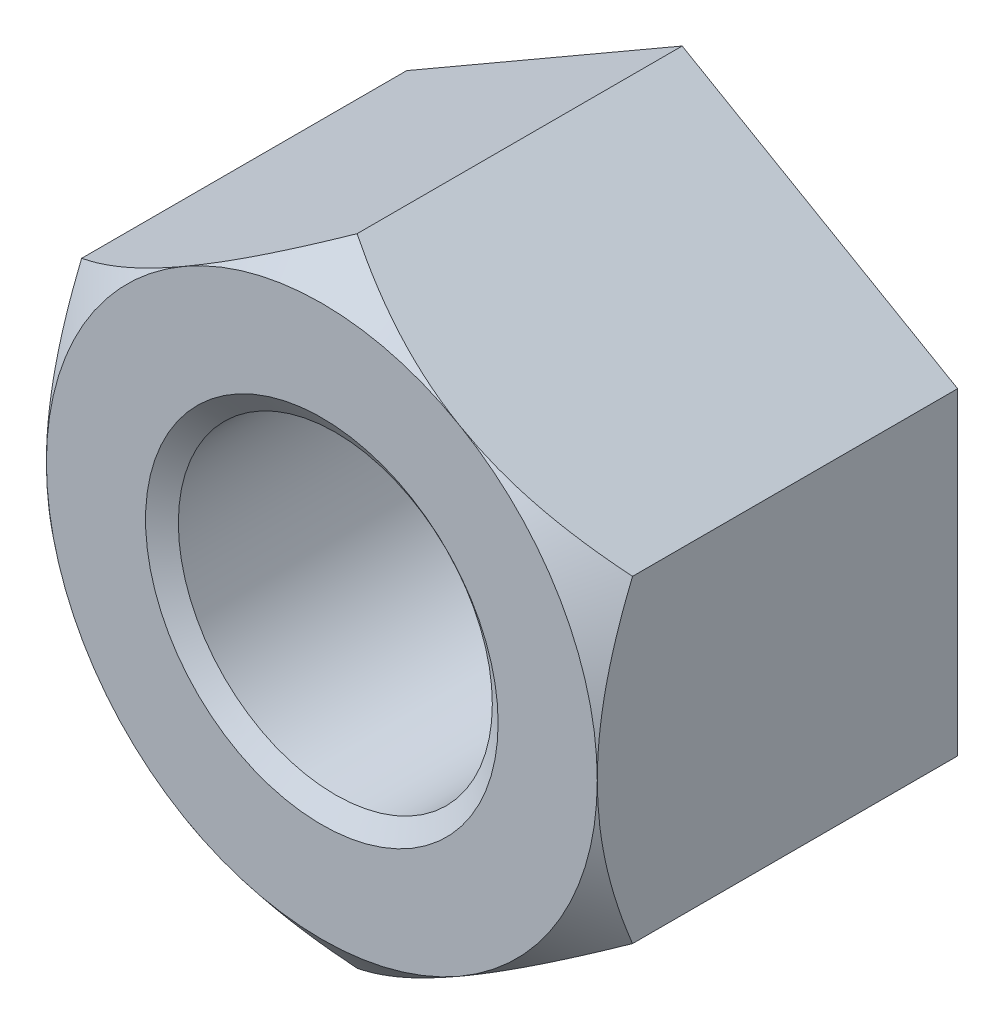
ISO-10303-21;
HEADER;
FILE_DESCRIPTION(('STEP AP214'),'2;1');
FILE_NAME('part.step','',(''),(''),'','','');
FILE_SCHEMA(('AUTOMOTIVE_DESIGN { 1 0 10303 214 1 1 1 1 }'));
ENDSEC;
DATA;
#1=APPLICATION_CONTEXT('core data for automotive mechanical design processes');
#2=APPLICATION_PROTOCOL_DEFINITION('international standard','automotive_design',2000,#1);
#3=PRODUCT_CONTEXT('',#1,'mechanical');
#4=PRODUCT('Part','Part','',(#3));
#5=PRODUCT_RELATED_PRODUCT_CATEGORY('part','',(#4));
#6=PRODUCT_DEFINITION_FORMATION('','',#4);
#7=PRODUCT_DEFINITION_CONTEXT('part definition',#1,'design');
#8=PRODUCT_DEFINITION('design','',#6,#7);
#9=PRODUCT_DEFINITION_SHAPE('','',#8);
#10=(LENGTH_UNIT() NAMED_UNIT(*) SI_UNIT(.MILLI.,.METRE.));
#11=(NAMED_UNIT(*) PLANE_ANGLE_UNIT() SI_UNIT($,.RADIAN.));
#12=(NAMED_UNIT(*) SI_UNIT($,.STERADIAN.) SOLID_ANGLE_UNIT());
#13=UNCERTAINTY_MEASURE_WITH_UNIT(LENGTH_MEASURE(1.E-05),#10,'distance_accuracy_value','');
#14=(GEOMETRIC_REPRESENTATION_CONTEXT(3) GLOBAL_UNCERTAINTY_ASSIGNED_CONTEXT((#13)) GLOBAL_UNIT_ASSIGNED_CONTEXT((#10,
#11,#12)) REPRESENTATION_CONTEXT('',''));
#15=CARTESIAN_POINT('',(0.,0.,0.));
#16=DIRECTION('',(0.,0.,1.));
#17=DIRECTION('',(1.,0.,0.));
#18=AXIS2_PLACEMENT_3D('',#15,#16,#17);
#19=CARTESIAN_POINT('',(0.,0.,-51.9176));
#20=DIRECTION('',(0.,0.,1.));
#21=DIRECTION('',(1.,0.,0.));
#22=AXIS2_PLACEMENT_3D('',#19,#20,#21);
#23=CYLINDRICAL_SURFACE('',#22,22.62124);
#24=CARTESIAN_POINT('',(0.,0.,-1.9457086988756));
#25=DIRECTION('',(0.,0.,1.));
#26=DIRECTION('',(1.,0.,0.));
#27=AXIS2_PLACEMENT_3D('',#24,#25,#26);
#28=CIRCLE('',#27,22.62124);
#29=CARTESIAN_POINT('',(22.62124,0.,-1.9457086988756));
#30=VERTEX_POINT('',#29);
#31=EDGE_CURVE('E130',#30,#30,#28,.F.);
#32=ORIENTED_EDGE('',*,*,#31,.F.);
#33=EDGE_LOOP('',(#32));
#34=FACE_BOUND('',#33,.T.);
#35=CARTESIAN_POINT('',(0.,0.,-49.9464913011244));
#36=DIRECTION('',(0.,0.,-1.));
#37=DIRECTION('',(-1.,0.,0.));
#38=AXIS2_PLACEMENT_3D('',#35,#36,#37);
#39=CIRCLE('',#38,22.62124);
#40=CARTESIAN_POINT('',(-22.62124,0.,-49.9464913011244));
#41=VERTEX_POINT('',#40);
#42=EDGE_CURVE('E37',#41,#41,#39,.F.);
#43=ORIENTED_EDGE('',*,*,#42,.F.);
#44=EDGE_LOOP('',(#43));
#45=FACE_BOUND('',#44,.T.);
#46=ADVANCED_FACE('F32',(#34,#45),#23,.F.);
#47=CARTESIAN_POINT('',(-79.3749999999999,0.,0.));
#48=DIRECTION('',(0.,0.,1.));
#49=DIRECTION('',(1.,0.,0.));
#50=AXIS2_PLACEMENT_3D('',#47,#48,#49);
#51=PLANE('',#50);
#52=CARTESIAN_POINT('',(0.,0.,0.));
#53=DIRECTION('',(0.,0.,1.));
#54=DIRECTION('',(1.,0.,0.));
#55=AXIS2_PLACEMENT_3D('',#52,#53,#54);
#56=CIRCLE('',#55,25.4);
#57=CARTESIAN_POINT('',(25.4,0.,0.));
#58=VERTEX_POINT('',#57);
#59=EDGE_CURVE('E217',#58,#58,#56,.T.);
#60=ORIENTED_EDGE('',*,*,#59,.F.);
#61=EDGE_LOOP('',(#60));
#62=FACE_BOUND('',#61,.T.);
#63=CARTESIAN_POINT('',(0.,0.,0.));
#64=DIRECTION('',(0.,0.,1.));
#65=DIRECTION('',(1.,0.,0.));
#66=AXIS2_PLACEMENT_3D('',#63,#64,#65);
#67=CIRCLE('',#66,39.6875);
#68=CARTESIAN_POINT('',(39.6875,0.,0.));
#69=VERTEX_POINT('',#68);
#70=CARTESIAN_POINT('',(19.84375,-34.3703832126949,0.));
#71=VERTEX_POINT('',#70);
#72=EDGE_CURVE('E11',#69,#71,#67,.F.);
#73=ORIENTED_EDGE('',*,*,#72,.F.);
#74=CARTESIAN_POINT('',(0.,0.,0.));
#75=DIRECTION('',(0.,0.,1.));
#76=DIRECTION('',(1.,0.,0.));
#77=AXIS2_PLACEMENT_3D('',#74,#75,#76);
#78=CIRCLE('',#77,39.6875);
#79=CARTESIAN_POINT('',(19.8437500000001,34.3703832126949,0.));
#80=VERTEX_POINT('',#79);
#81=EDGE_CURVE('E122',#69,#80,#78,.T.);
#82=ORIENTED_EDGE('',*,*,#81,.T.);
#83=CARTESIAN_POINT('',(-19.84375,34.3703832126949,0.));
#84=VERTEX_POINT('',#83);
#85=EDGE_CURVE('E44',#84,#80,#67,.F.);
#86=ORIENTED_EDGE('',*,*,#85,.F.);
#87=CARTESIAN_POINT('',(-39.6875,0.,0.));
#88=VERTEX_POINT('',#87);
#89=EDGE_CURVE('E271',#88,#84,#67,.F.);
#90=ORIENTED_EDGE('',*,*,#89,.F.);
#91=CARTESIAN_POINT('',(-19.84375,-34.3703832126949,0.));
#92=VERTEX_POINT('',#91);
#93=EDGE_CURVE('E273',#92,#88,#67,.F.);
#94=ORIENTED_EDGE('',*,*,#93,.F.);
#95=EDGE_CURVE('E42',#71,#92,#67,.F.);
#96=ORIENTED_EDGE('',*,*,#95,.F.);
#97=EDGE_LOOP('',(#73,#82,#86,#90,#94,#96));
#98=FACE_BOUND('',#97,.T.);
#99=ADVANCED_FACE('F132',(#62,#98),#51,.T.);
#100=CARTESIAN_POINT('',(0.,45.8271776169266,-51.9176));
#101=DIRECTION('',(-0.500000000000001,0.866025403784438,0.));
#102=DIRECTION('',(-0.866025403784438,-0.500000000000001,0.));
#103=AXIS2_PLACEMENT_3D('',#100,#101,#102);
#104=PLANE('',#103);
#105=CARTESIAN_POINT('',(0.000200000000008648,45.8272930869804,-5.08009554086177));
#106=CARTESIAN_POINT('',(-0.675362378218132,45.4372569660618,-4.75740980637057));
#107=CARTESIAN_POINT('',(-1.3547569213277,45.0450083437115,-4.44518483659009));
#108=CARTESIAN_POINT('',(-2.72161040098432,44.255855119289,-3.8444644403435));
#109=CARTESIAN_POINT('',(-3.40907190062726,43.8589490374126,-3.55597680269755));
#110=CARTESIAN_POINT('',(-4.79420473338667,43.0592422235556,-3.00488379402706));
#111=CARTESIAN_POINT('',(-5.49190147905994,42.6564268196284,-2.74236315877935));
#112=CARTESIAN_POINT('',(-6.89523688741963,41.8462107438486,-2.24748448913265));
#113=CARTESIAN_POINT('',(-7.60087484104338,41.4388104813735,-2.0151237846422));
#114=CARTESIAN_POINT('',(-9.01334120141884,40.6233226479894,-1.58581833885084));
#115=CARTESIAN_POINT('',(-9.72010005572324,40.2152752332046,-1.38856992044724));
#116=CARTESIAN_POINT('',(-11.1404844329942,39.3952159306345,-1.03010323704616));
#117=CARTESIAN_POINT('',(-11.8541100481971,38.9832039895965,-0.868885456729332));
#118=CARTESIAN_POINT('',(-13.2863448470649,38.1563028429274,-0.585602272074939));
#119=CARTESIAN_POINT('',(-14.0049472620728,37.7414175451823,-0.463491507583696));
#120=CARTESIAN_POINT('',(-15.446538218661,36.9091146183348,-0.260639689408306));
#121=CARTESIAN_POINT('',(-16.1695267221796,36.4916970112073,-0.179898277247445));
#122=CARTESIAN_POINT('',(-17.630331069793,35.6483012278793,-0.0605545378182199));
#123=CARTESIAN_POINT('',(-18.368192043889,35.2222969958605,-0.0226825232988908));
#124=CARTESIAN_POINT('',(-19.8446204307072,34.3698806692918,0.00757152347880483));
#125=CARTESIAN_POINT('',(-20.5831878468339,33.9434685727764,-4.66645945184485E-05));
#126=CARTESIAN_POINT('',(-22.059242806536,33.0912678444537,-0.0606042335508548));
#127=CARTESIAN_POINT('',(-22.7967297343713,32.6654795681441,-0.113563491625037));
#128=CARTESIAN_POINT('',(-24.2683079349113,31.8158634979287,-0.263592304194731));
#129=CARTESIAN_POINT('',(-25.0023992066788,31.3920357045641,-0.360661870865582));
#130=CARTESIAN_POINT('',(-26.465573084514,30.5472718723246,-0.596784274101464));
#131=CARTESIAN_POINT('',(-27.194654967739,30.1263362507834,-0.735843044678707));
#132=CARTESIAN_POINT('',(-28.6463836691976,29.288180294206,-1.05312836783003));
#133=CARTESIAN_POINT('',(-29.3690302955407,28.8709600699578,-1.23135608432558));
#134=CARTESIAN_POINT('',(-30.8067522929465,28.0408908877358,-1.62370548470428));
#135=CARTESIAN_POINT('',(-31.5218294409757,27.6280409038298,-1.83781853634994));
#136=CARTESIAN_POINT('',(-32.944072074641,26.8069087364301,-2.2985964240863));
#137=CARTESIAN_POINT('',(-33.6512373169414,26.3986266934264,-2.54526225838923));
#138=CARTESIAN_POINT('',(-34.8062681966621,25.7317693040973,-2.97446619349774));
#139=CARTESIAN_POINT('',(-35.2565422540784,25.471803455839,-3.14844506359477));
#140=CARTESIAN_POINT('',(-36.1535852489752,24.9538954412606,-3.50755980192611));
#141=CARTESIAN_POINT('',(-36.6003552410455,24.695952666073,-3.69269215538246));
#142=CARTESIAN_POINT('',(-37.4890449541568,24.1828674209821,-4.07269340288885));
#143=CARTESIAN_POINT('',(-37.9309759964886,23.9277184147286,-4.26752708270077));
#144=CARTESIAN_POINT('',(-38.811702131736,23.4192309434612,-4.66680287394708));
#145=CARTESIAN_POINT('',(-39.2504964008522,23.1658929540681,-4.87124740983446));
#146=CARTESIAN_POINT('',(-39.6877,22.9134733384094,-5.08009554086174));
#147=B_SPLINE_CURVE_WITH_KNOTS('',3,(#105,#106,#107,#108,#109,#110,#111,#112,#113,#114,#115,
#116,#117,#118,#119,#120,#121,#122,#123,#124,#125,#126,#127,#128,#129,#130,#131,#132,#133,#134,
#135,#136,#137,#138,#139,#140,#141,#142,#143,#144,#145,#146),.UNSPECIFIED.,.F.,.F.,(4,2,2,2,2,2,
2,2,2,2,2,2,2,2,2,2,2,2,2,2,4),(0.,2.53259620096936,5.06602012425204,7.60745580196207,
10.1486663299222,12.6667002043744,15.1847679491354,17.6999043239812,20.2150189041161,
22.7723642868658,25.329722056122,27.888201526601,30.4466817032726,33.0055236196886,
35.5644415834371,38.1227448791952,40.6811266420771,42.3258117324123,43.9699812198112,
45.608565036544,47.2475644472487),.UNSPECIFIED.);
#148=CARTESIAN_POINT('',(0.,45.8271776169266,-5.08));
#149=VERTEX_POINT('',#148);
#150=EDGE_CURVE('E182',#149,#84,#147,.T.);
#151=ORIENTED_EDGE('',*,*,#150,.F.);
#152=DIRECTION('',(0.,0.,1.));
#153=VECTOR('',#152,1.);
#154=CARTESIAN_POINT('',(0.,45.8271776169266,-51.9176));
#155=LINE('',#154,#153);
#156=CARTESIAN_POINT('',(0.,45.8271776169266,-51.9176));
#157=VERTEX_POINT('',#156);
#158=EDGE_CURVE('E241',#157,#149,#155,.T.);
#159=ORIENTED_EDGE('',*,*,#158,.F.);
#160=DIRECTION('',(-0.866025403784438,-0.500000000000001,0.));
#161=VECTOR('',#160,1.);
#162=CARTESIAN_POINT('',(0.,45.8271776169266,-51.9176));
#163=LINE('',#162,#161);
#164=CARTESIAN_POINT('',(-39.6875,22.9135888084633,-51.9176));
#165=VERTEX_POINT('',#164);
#166=EDGE_CURVE('E138',#157,#165,#163,.T.);
#167=ORIENTED_EDGE('',*,*,#166,.T.);
#168=DIRECTION('',(0.,0.,1.));
#169=VECTOR('',#168,1.);
#170=CARTESIAN_POINT('',(-39.6875,22.9135888084633,-51.9176));
#171=LINE('',#170,#169);
#172=CARTESIAN_POINT('',(-39.6875,22.9135888084633,-5.08));
#173=VERTEX_POINT('',#172);
#174=EDGE_CURVE('E228',#165,#173,#171,.T.);
#175=ORIENTED_EDGE('',*,*,#174,.T.);
#176=EDGE_CURVE('E177',#84,#173,#147,.T.);
#177=ORIENTED_EDGE('',*,*,#176,.F.);
#178=EDGE_LOOP('',(#151,#159,#167,#175,#177));
#179=FACE_BOUND('',#178,.T.);
#180=ADVANCED_FACE('F34',(#179),#104,.T.);
#181=CARTESIAN_POINT('',(39.6875,22.9135888084632,-51.9176));
#182=DIRECTION('',(0.500000000000001,0.866025403784438,0.));
#183=DIRECTION('',(-0.866025403784438,0.500000000000001,0.));
#184=AXIS2_PLACEMENT_3D('',#181,#182,#183);
#185=PLANE('',#184);
#186=CARTESIAN_POINT('',(39.6877,22.9134733384094,-5.08009554086173));
#187=CARTESIAN_POINT('',(39.0121376217819,23.303509459328,-4.75740980637053));
#188=CARTESIAN_POINT('',(38.3327430786723,23.6957580816783,-4.44518483659006));
#189=CARTESIAN_POINT('',(36.9658895990157,24.4849113061008,-3.84446444034347));
#190=CARTESIAN_POINT('',(36.2784280993727,24.8818173879772,-3.55597680269752));
#191=CARTESIAN_POINT('',(34.8932952666133,25.6815242018342,-3.00488379402703));
#192=CARTESIAN_POINT('',(34.1955985209401,26.0843396057614,-2.74236315877932));
#193=CARTESIAN_POINT('',(32.7922631125804,26.8945556815412,-2.24748448913262));
#194=CARTESIAN_POINT('',(32.0866251589566,27.3019559440163,-2.01512378464218));
#195=CARTESIAN_POINT('',(30.6741587985812,28.1174437774003,-1.58581833885082));
#196=CARTESIAN_POINT('',(29.9673999442768,28.5254911921851,-1.38856992044722));
#197=CARTESIAN_POINT('',(28.5470155670058,29.3455504947553,-1.03010323704614));
#198=CARTESIAN_POINT('',(27.8333899518029,29.7575624357933,-0.868885456729311));
#199=CARTESIAN_POINT('',(26.4011551529351,30.5844635824624,-0.585602272074925));
#200=CARTESIAN_POINT('',(25.6825527379272,30.9993488802075,-0.463491507583685));
#201=CARTESIAN_POINT('',(24.240961781339,31.831651807055,-0.260639689408294));
#202=CARTESIAN_POINT('',(23.5179732778204,32.2490694141825,-0.179898277247429));
#203=CARTESIAN_POINT('',(22.057168930207,33.0924651975105,-0.060554537818203));
#204=CARTESIAN_POINT('',(21.3193079561111,33.5184694295293,-0.0226825232988767));
#205=CARTESIAN_POINT('',(19.8428795692928,34.370885756098,0.0075715234788147));
#206=CARTESIAN_POINT('',(19.1043121531661,34.7972978526134,-4.66645945098664E-05));
#207=CARTESIAN_POINT('',(17.628257193464,35.6494985809361,-0.0606042335508479));
#208=CARTESIAN_POINT('',(16.8907702656287,36.0752868572457,-0.11356349162503));
#209=CARTESIAN_POINT('',(15.4191920650887,36.924902927461,-0.263592304194725));
#210=CARTESIAN_POINT('',(14.6851007933213,37.3487307208257,-0.360661870865576));
#211=CARTESIAN_POINT('',(13.221926915486,38.1934945530651,-0.596784274101456));
#212=CARTESIAN_POINT('',(12.492845032261,38.6144301746064,-0.7358430446787));
#213=CARTESIAN_POINT('',(11.0411163308025,39.4525861311838,-1.05312836783002));
#214=CARTESIAN_POINT('',(10.3184697044593,39.869806355432,-1.23135608432557));
#215=CARTESIAN_POINT('',(8.88074770705356,40.699875537654,-1.62370548470428));
#216=CARTESIAN_POINT('',(8.16567055902438,41.11272552156,-1.83781853634994));
#217=CARTESIAN_POINT('',(6.74342792535908,41.9338576889596,-2.29859642408631));
#218=CARTESIAN_POINT('',(6.0362626830586,42.3421397319634,-2.54526225838923));
#219=CARTESIAN_POINT('',(4.8812318033379,43.0089971212925,-2.97446619349775));
#220=CARTESIAN_POINT('',(4.43095774592168,43.2689629695508,-3.14844506359478));
#221=CARTESIAN_POINT('',(3.53391475102487,43.7868709841292,-3.50755980192612));
#222=CARTESIAN_POINT('',(3.08714475895457,44.0448137593168,-3.69269215538248));
#223=CARTESIAN_POINT('',(2.19845504584327,44.5578990044077,-4.07269340288887));
#224=CARTESIAN_POINT('',(1.75652400351137,44.8130480106612,-4.26752708270078));
#225=CARTESIAN_POINT('',(0.875797868263966,45.3215354819287,-4.6668028739471));
#226=CARTESIAN_POINT('',(0.437003599147834,45.5748734713217,-4.87124740983448));
#227=CARTESIAN_POINT('',(-0.000199999999990547,45.8272930869804,-5.08009554086177));
#228=B_SPLINE_CURVE_WITH_KNOTS('',3,(#186,#187,#188,#189,#190,#191,#192,#193,#194,#195,#196,
#197,#198,#199,#200,#201,#202,#203,#204,#205,#206,#207,#208,#209,#210,#211,#212,#213,#214,#215,
#216,#217,#218,#219,#220,#221,#222,#223,#224,#225,#226,#227),.UNSPECIFIED.,.F.,.F.,(4,2,2,2,2,2,
2,2,2,2,2,2,2,2,2,2,2,2,2,2,4),(0.,2.53259620096935,5.06602012425204,7.60745580196207,
10.1486663299222,12.6667002043744,15.1847679491354,17.6999043239812,20.2150189041161,
22.7723642868658,25.329722056122,27.888201526601,30.4466817032726,33.0055236196886,
35.564441583437,38.1227448791951,40.681126642077,42.3258117324123,43.9699812198112,
45.608565036544,47.2475644472487),.UNSPECIFIED.);
#229=CARTESIAN_POINT('',(39.6875,22.9135888084633,-5.08));
#230=VERTEX_POINT('',#229);
#231=EDGE_CURVE('E125',#230,#80,#228,.T.);
#232=ORIENTED_EDGE('',*,*,#231,.F.);
#233=DIRECTION('',(0.,0.,1.));
#234=VECTOR('',#233,1.);
#235=CARTESIAN_POINT('',(39.6875,22.9135888084632,-51.9176));
#236=LINE('',#235,#234);
#237=CARTESIAN_POINT('',(39.6875,22.9135888084632,-51.9176));
#238=VERTEX_POINT('',#237);
#239=EDGE_CURVE('E137',#238,#230,#236,.T.);
#240=ORIENTED_EDGE('',*,*,#239,.F.);
#241=DIRECTION('',(-0.866025403784438,0.500000000000001,0.));
#242=VECTOR('',#241,1.);
#243=CARTESIAN_POINT('',(39.6875,22.9135888084632,-51.9176));
#244=LINE('',#243,#242);
#245=EDGE_CURVE('E232',#238,#157,#244,.T.);
#246=ORIENTED_EDGE('',*,*,#245,.T.);
#247=ORIENTED_EDGE('',*,*,#158,.T.);
#248=EDGE_CURVE('E148',#80,#149,#228,.T.);
#249=ORIENTED_EDGE('',*,*,#248,.F.);
#250=EDGE_LOOP('',(#232,#240,#246,#247,#249));
#251=FACE_BOUND('',#250,.T.);
#252=ADVANCED_FACE('F163',(#251),#185,.T.);
#253=CARTESIAN_POINT('',(39.6875,22.9135888084632,-51.9176));
#254=DIRECTION('',(-1.,0.,0.));
#255=DIRECTION('',(0.,-1.,0.));
#256=AXIS2_PLACEMENT_3D('',#253,#254,#255);
#257=PLANE('',#256);
#258=ORIENTED_EDGE('',*,*,#239,.T.);
#259=CARTESIAN_POINT('',(39.6875,-51.6328225617732,-21.0457198261144));
#260=CARTESIAN_POINT('',(39.6875,-50.9711763672413,-20.6116874485865));
#261=CARTESIAN_POINT('',(39.6875,-50.3081162489392,-20.1798041243193));
#262=CARTESIAN_POINT('',(39.6875,-48.9789178290214,-19.3207795147177));
#263=CARTESIAN_POINT('',(39.6875,-48.3127794809869,-18.8936383012255));
#264=CARTESIAN_POINT('',(39.6875,-46.9770520322295,-18.0444645788605));
#265=CARTESIAN_POINT('',(39.6875,-46.3074622267201,-17.6224331775177));
#266=CARTESIAN_POINT('',(39.6875,-44.9647085157808,-16.7841033357561));
#267=CARTESIAN_POINT('',(39.6875,-44.2915446227527,-16.3678048754624));
#268=CARTESIAN_POINT('',(39.6875,-42.2568910350694,-15.1226295216118));
#269=CARTESIAN_POINT('',(39.6875,-40.8894876977901,-14.303373472346));
#270=CARTESIAN_POINT('',(39.6875,-38.1364157157677,-12.6961963985621));
#271=CARTESIAN_POINT('',(39.6875,-36.7507482016962,-11.9082734463391));
#272=CARTESIAN_POINT('',(39.6875,-34.6202465175937,-10.7357414695621));
#273=CARTESIAN_POINT('',(39.6875,-33.883142153706,-10.3370700215875));
#274=CARTESIAN_POINT('',(39.6875,-32.4025093553702,-9.5518101034775));
#275=CARTESIAN_POINT('',(39.6875,-31.6589809026361,-9.1652216677508));
#276=CARTESIAN_POINT('',(39.6875,-30.1648802706844,-8.40558030869589));
#277=CARTESIAN_POINT('',(39.6875,-29.4143069750479,-8.03252957792258));
#278=CARTESIAN_POINT('',(39.6875,-27.9057210128597,-7.30176643813181));
#279=CARTESIAN_POINT('',(39.6875,-27.1477083873151,-6.94405394462548));
#280=CARTESIAN_POINT('',(39.6875,-25.6257322693701,-6.24685408494801));
#281=CARTESIAN_POINT('',(39.6875,-24.8617895693373,-5.9073214280591));
#282=CARTESIAN_POINT('',(39.6875,-23.3255198091508,-5.24768587063815));
#283=CARTESIAN_POINT('',(39.6875,-22.5531925628723,-4.92758340247225));
#284=CARTESIAN_POINT('',(39.6875,-21.0000557177916,-4.30940863178999));
#285=CARTESIAN_POINT('',(39.6875,-20.2192491500448,-4.01132873620555));
#286=CARTESIAN_POINT('',(39.6875,-18.6486688993825,-3.43983380916539));
#287=CARTESIAN_POINT('',(39.6875,-17.8588956110767,-3.16641769700037));
#288=CARTESIAN_POINT('',(39.6875,-16.2782209721058,-2.64980510868287));
#289=CARTESIAN_POINT('',(39.6875,-15.4874096982703,-2.40633404284441));
#290=CARTESIAN_POINT('',(39.6875,-13.8971196730041,-1.949521193496));
#291=CARTESIAN_POINT('',(39.6875,-13.0976411780003,-1.73617852121719));
#292=CARTESIAN_POINT('',(39.6875,-11.490505656062,-1.34270689884543));
#293=CARTESIAN_POINT('',(39.6875,-10.6828485577701,-1.16257823880472));
#294=CARTESIAN_POINT('',(39.6875,-9.06026613990107,-0.838523837576269));
#295=CARTESIAN_POINT('',(39.6875,-8.24534084565409,-0.694597970270693));
#296=CARTESIAN_POINT('',(39.6875,-6.62443803963803,-0.44789053679595));
#297=CARTESIAN_POINT('',(39.6875,-5.81856783479586,-0.344407435972398));
#298=CARTESIAN_POINT('',(39.6875,-4.20271348464461,-0.176943966081104));
#299=CARTESIAN_POINT('',(39.6875,-3.39272937158293,-0.112963287848917));
#300=CARTESIAN_POINT('',(39.6875,-1.77060014097972,-0.0258418024225941));
#301=CARTESIAN_POINT('',(39.6875,-0.958455144349754,-0.00269875637746664));
#302=CARTESIAN_POINT('',(39.6875,0.665955806422227,0.00225284073911517));
#303=CARTESIAN_POINT('',(39.6875,1.47822175873214,-0.0159380354063192));
#304=CARTESIAN_POINT('',(39.6875,3.04262978620853,-0.0904816967942533));
#305=CARTESIAN_POINT('',(39.6875,3.79490888298955,-0.144006137982676));
#306=CARTESIAN_POINT('',(39.6875,5.29621422506813,-0.285354448282872));
#307=CARTESIAN_POINT('',(39.6875,6.04524051937348,-0.373177798810451));
#308=CARTESIAN_POINT('',(39.6875,7.53870946417253,-0.581619226597829));
#309=CARTESIAN_POINT('',(39.6875,8.28315200884954,-0.70223805806608));
#310=CARTESIAN_POINT('',(39.6875,9.76635407238924,-0.974351273005124));
#311=CARTESIAN_POINT('',(39.6875,10.5051135293359,-1.125845992369));
#312=CARTESIAN_POINT('',(39.6875,11.9915712027742,-1.4610042876546));
#313=CARTESIAN_POINT('',(39.6875,12.739131747527,-1.64527612429139));
#314=CARTESIAN_POINT('',(39.6875,14.22692970878,-2.04125829546036));
#315=CARTESIAN_POINT('',(39.6875,14.9671670312339,-2.25296898187678));
#316=CARTESIAN_POINT('',(39.6875,16.4398374833948,-2.70128400744475));
#317=CARTESIAN_POINT('',(39.6875,17.1722725001704,-2.93788216950768));
#318=CARTESIAN_POINT('',(39.6875,18.6294175284696,-3.43359252913646));
#319=CARTESIAN_POINT('',(39.6875,19.3541279258292,-3.6927035962362));
#320=CARTESIAN_POINT('',(39.6875,20.8232310833092,-4.24136165425784));
#321=CARTESIAN_POINT('',(39.6875,21.5673316646934,-4.53168910379808));
#322=CARTESIAN_POINT('',(39.6875,23.0476598759365,-5.13183376214373));
#323=CARTESIAN_POINT('',(39.6875,23.7838870428162,-5.44165210977677));
#324=CARTESIAN_POINT('',(39.6875,25.2489982758851,-6.07874085809014));
#325=CARTESIAN_POINT('',(39.6875,25.9778800616277,-6.4060164914637));
#326=CARTESIAN_POINT('',(39.6875,27.4284730415926,-7.07603037663764));
#327=CARTESIAN_POINT('',(39.6875,28.150184352275,-7.41876837680201));
#328=CARTESIAN_POINT('',(39.6875,29.5878108526177,-8.11847594604665));
#329=CARTESIAN_POINT('',(39.6875,30.3037174013003,-8.47546323894451));
#330=CARTESIAN_POINT('',(39.6875,31.7292596203181,-9.20177066567085));
#331=CARTESIAN_POINT('',(39.6875,32.4388951343641,-9.57109110578087));
#332=CARTESIAN_POINT('',(39.6875,33.8522184642118,-10.3206859178583));
#333=CARTESIAN_POINT('',(39.6875,34.5559071276958,-10.7009586933822));
#334=CARTESIAN_POINT('',(39.6875,35.9578716156223,-11.4713640904577));
#335=CARTESIAN_POINT('',(39.6875,36.6561473515262,-11.8614968728458));
#336=CARTESIAN_POINT('',(39.6875,38.7525009714226,-13.0502493271726));
#337=CARTESIAN_POINT('',(39.6875,40.1429535242398,-13.8623368759573));
#338=CARTESIAN_POINT('',(39.6875,42.9065478219297,-15.5153833509438));
#339=CARTESIAN_POINT('',(39.6875,44.2796891774659,-16.3563429249119));
#340=CARTESIAN_POINT('',(39.6875,47.0102618878544,-18.0612949767672));
#341=CARTESIAN_POINT('',(39.6875,48.3677033687017,-18.9252712668503));
#342=CARTESIAN_POINT('',(39.6875,51.0699566698335,-20.6726859018107));
#343=CARTESIAN_POINT('',(39.6875,52.4147686196264,-21.5561240468069));
#344=CARTESIAN_POINT('',(39.6875,54.9416289010451,-23.2381057356394));
#345=CARTESIAN_POINT('',(39.6875,56.124835891438,-24.0349116057157));
#346=CARTESIAN_POINT('',(39.6875,58.4837915512901,-25.6394756549528));
#347=CARTESIAN_POINT('',(39.6875,59.6595402325006,-26.447233816851));
#348=CARTESIAN_POINT('',(39.6875,62.004680365178,-28.0723416749042));
#349=CARTESIAN_POINT('',(39.6875,63.1740707022467,-28.8896929778486));
#350=CARTESIAN_POINT('',(39.6875,65.5070659307336,-30.5326124668601));
#351=CARTESIAN_POINT('',(39.6875,66.6706708066629,-31.358180674908));
#352=CARTESIAN_POINT('',(39.6875,68.9768909376784,-33.0051660939369));
#353=CARTESIAN_POINT('',(39.6875,70.1195757715592,-33.8264859330917));
#354=CARTESIAN_POINT('',(39.6875,72.4005033043231,-35.475271874458));
#355=CARTESIAN_POINT('',(39.6875,73.5387459965324,-36.3027379858981));
#356=CARTESIAN_POINT('',(39.6875,75.8109571954491,-37.9628759019715));
#357=CARTESIAN_POINT('',(39.6875,76.9449267693809,-38.795546246655));
#358=CARTESIAN_POINT('',(39.6875,79.2092896185033,-40.4657187843561));
#359=CARTESIAN_POINT('',(39.6875,80.3396829202291,-41.3032209413921));
#360=CARTESIAN_POINT('',(39.6875,81.468491590366,-42.1428481011268));
#361=B_SPLINE_CURVE_WITH_KNOTS('',3,(#259,#260,#261,#262,#263,#264,#265,#266,#267,#268,#269,
#270,#271,#272,#273,#274,#275,#276,#277,#278,#279,#280,#281,#282,#283,#284,#285,#286,#287,#288,
#289,#290,#291,#292,#293,#294,#295,#296,#297,#298,#299,#300,#301,#302,#303,#304,#305,#306,#307,
#308,#309,#310,#311,#312,#313,#314,#315,#316,#317,#318,#319,#320,#321,#322,#323,#324,#325,#326,
#327,#328,#329,#330,#331,#332,#333,#334,#335,#336,#337,#338,#339,#340,#341,#342,#343,#344,#345,
#346,#347,#348,#349,#350,#351,#352,#353,#354,#355,#356,#357,#358,#359,#360),.UNSPECIFIED.,.F.,
.F.,(4,2,2,2,2,2,2,2,2,2,2,2,2,2,2,2,2,2,2,2,2,2,2,2,2,2,2,2,2,2,2,2,2,2,2,2,2,2,2,2,2,2,2,2,2,
2,2,2,2,2,4),(0.,2.37390854149781,4.74785299838772,7.12230310410022,9.49674497607132,
14.2785351295475,19.060030636564,21.5739708021067,24.0879181259218,26.6022708056346,
29.1166096335522,31.6243614525894,34.1321690543991,36.6391079253516,39.1459368946939,
41.6277244169124,44.1094387126428,46.59117467973,49.0729020011997,51.5094354548976,
53.9459498389027,56.3823306411635,58.8186776815843,61.0804212327495,63.3421305886858,
65.6038919622954,67.8656779425026,70.1749197046787,72.4841910842122,74.7928906474037,
77.101474348163,79.4973670049812,81.8933997809175,84.2901548306221,86.6868708893724,
89.0866671212436,91.4865229940724,93.8860308100302,96.2855777920507,101.11578528758,
105.946101223472,110.773105264199,115.600059752747,119.87946643631,124.158866375553,
128.438993616511,132.719132310206,136.940798018509,141.162470066988,145.383006678417,
149.603511900633),.UNSPECIFIED.);
#362=EDGE_CURVE('E117',#230,#69,#361,.F.);
#363=ORIENTED_EDGE('',*,*,#362,.T.);
#364=CARTESIAN_POINT('',(39.6875,-22.9135888084634,-5.08));
#365=VERTEX_POINT('',#364);
#366=EDGE_CURVE('E106',#69,#365,#361,.F.);
#367=ORIENTED_EDGE('',*,*,#366,.T.);
#368=DIRECTION('',(0.,0.,1.));
#369=VECTOR('',#368,1.);
#370=CARTESIAN_POINT('',(39.6875,-22.9135888084634,-51.9176));
#371=LINE('',#370,#369);
#372=CARTESIAN_POINT('',(39.6875,-22.9135888084634,-51.9176));
#373=VERTEX_POINT('',#372);
#374=EDGE_CURVE('E238',#373,#365,#371,.T.);
#375=ORIENTED_EDGE('',*,*,#374,.F.);
#376=DIRECTION('',(0.,-1.,0.));
#377=VECTOR('',#376,1.);
#378=CARTESIAN_POINT('',(39.6875,22.9135888084632,-51.9176));
#379=LINE('',#378,#377);
#380=EDGE_CURVE('E246',#238,#373,#379,.T.);
#381=ORIENTED_EDGE('',*,*,#380,.F.);
#382=EDGE_LOOP('',(#258,#363,#367,#375,#381));
#383=FACE_BOUND('',#382,.T.);
#384=ADVANCED_FACE('F135',(#383),#257,.F.);
#385=CARTESIAN_POINT('',(0.,-45.8271776169267,-51.9176));
#386=DIRECTION('',(0.500000000000001,-0.866025403784438,0.));
#387=DIRECTION('',(0.866025403784438,0.500000000000001,0.));
#388=AXIS2_PLACEMENT_3D('',#385,#386,#387);
#389=PLANE('',#388);
#390=CARTESIAN_POINT('',(-0.000200000000006572,-45.8272930869805,-5.08009554086186));
#391=CARTESIAN_POINT('',(0.675362378218134,-45.4372569660619,-4.75740980637066));
#392=CARTESIAN_POINT('',(1.3547569213277,-45.0450083437116,-4.44518483659018));
#393=CARTESIAN_POINT('',(2.72161040098433,-44.2558551192891,-3.84446444034359));
#394=CARTESIAN_POINT('',(3.40907190062727,-43.8589490374127,-3.55597680269764));
#395=CARTESIAN_POINT('',(4.79420473338668,-43.0592422235557,-3.00488379402714));
#396=CARTESIAN_POINT('',(5.49190147905996,-42.6564268196285,-2.74236315877943));
#397=CARTESIAN_POINT('',(6.89523688741965,-41.8462107438487,-2.24748448913273));
#398=CARTESIAN_POINT('',(7.6008748410434,-41.4388104813736,-2.01512378464228));
#399=CARTESIAN_POINT('',(9.01334120141887,-40.6233226479895,-1.58581833885093));
#400=CARTESIAN_POINT('',(9.72010005572326,-40.2152752332047,-1.38856992044732));
#401=CARTESIAN_POINT('',(11.1404844329942,-39.3952159306346,-1.03010323704624));
#402=CARTESIAN_POINT('',(11.8541100481972,-38.9832039895966,-0.868885456729405));
#403=CARTESIAN_POINT('',(13.2863448470649,-38.1563028429275,-0.585602272075015));
#404=CARTESIAN_POINT('',(14.0049472620729,-37.7414175451824,-0.463491507583776));
#405=CARTESIAN_POINT('',(15.446538218661,-36.9091146183349,-0.260639689408387));
#406=CARTESIAN_POINT('',(16.1695267221796,-36.4916970112074,-0.179898277247523));
#407=CARTESIAN_POINT('',(17.6303310697931,-35.6483012278794,-0.060554537818296));
#408=CARTESIAN_POINT('',(18.368192043889,-35.2222969958606,-0.022682523298969));
#409=CARTESIAN_POINT('',(19.8446204307073,-34.3698806692919,0.00757152347872322));
#410=CARTESIAN_POINT('',(20.583187846834,-33.9434685727764,-4.66645946012748E-05));
#411=CARTESIAN_POINT('',(22.059242806536,-33.0912678444538,-0.0606042335509363));
#412=CARTESIAN_POINT('',(22.7967297343714,-32.6654795681442,-0.113563491625116));
#413=CARTESIAN_POINT('',(24.2683079349114,-31.8158634979288,-0.263592304194811));
#414=CARTESIAN_POINT('',(25.0023992066788,-31.3920357045641,-0.360661870865665));
#415=CARTESIAN_POINT('',(26.4655730845141,-30.5472718723247,-0.596784274101547));
#416=CARTESIAN_POINT('',(27.1946549677391,-30.1263362507835,-0.735843044678787));
#417=CARTESIAN_POINT('',(28.6463836691977,-29.2881802942061,-1.05312836783011));
#418=CARTESIAN_POINT('',(29.3690302955408,-28.8709600699579,-1.23135608432566));
#419=CARTESIAN_POINT('',(30.8067522929466,-28.0408908877358,-1.62370548470437));
#420=CARTESIAN_POINT('',(31.5218294409758,-27.6280409038298,-1.83781853635002));
#421=CARTESIAN_POINT('',(32.9440720746411,-26.8069087364302,-2.29859642408639));
#422=CARTESIAN_POINT('',(33.6512373169415,-26.3986266934265,-2.54526225838932));
#423=CARTESIAN_POINT('',(34.8062681966622,-25.7317693040974,-2.97446619349783));
#424=CARTESIAN_POINT('',(35.2565422540784,-25.471803455839,-3.14844506359486));
#425=CARTESIAN_POINT('',(36.1535852489752,-24.9538954412607,-3.50755980192619));
#426=CARTESIAN_POINT('',(36.6003552410455,-24.6959526660731,-3.69269215538255));
#427=CARTESIAN_POINT('',(37.4890449541568,-24.1828674209822,-4.07269340288892));
#428=CARTESIAN_POINT('',(37.9309759964887,-23.9277184147287,-4.26752708270083));
#429=CARTESIAN_POINT('',(38.8117021317361,-23.4192309434612,-4.66680287394714));
#430=CARTESIAN_POINT('',(39.2504964008522,-23.1658929540682,-4.87124740983451));
#431=CARTESIAN_POINT('',(39.6877,-22.9134733384095,-5.08009554086179));
#432=B_SPLINE_CURVE_WITH_KNOTS('',3,(#390,#391,#392,#393,#394,#395,#396,#397,#398,#399,#400,
#401,#402,#403,#404,#405,#406,#407,#408,#409,#410,#411,#412,#413,#414,#415,#416,#417,#418,#419,
#420,#421,#422,#423,#424,#425,#426,#427,#428,#429,#430,#431),.UNSPECIFIED.,.F.,.F.,(4,2,2,2,2,2,
2,2,2,2,2,2,2,2,2,2,2,2,2,2,4),(0.,2.53259620096937,5.06602012425206,7.60745580196209,
10.1486663299222,12.6667002043745,15.1847679491355,17.6999043239812,20.2150189041161,
22.7723642868659,25.3297220561221,27.8882015266011,30.4466817032727,33.0055236196887,
35.5644415834372,38.1227448791953,40.6811266420772,42.3258117324124,43.9699812198113,
45.6085650365441,47.2475644472487),.UNSPECIFIED.);
#433=CARTESIAN_POINT('',(-1.97758476261356E-13,-45.8271776169266,-5.08));
#434=VERTEX_POINT('',#433);
#435=EDGE_CURVE('E51',#434,#71,#432,.T.);
#436=ORIENTED_EDGE('',*,*,#435,.F.);
#437=DIRECTION('',(0.,0.,1.));
#438=VECTOR('',#437,1.);
#439=CARTESIAN_POINT('',(0.,-45.8271776169267,-51.9176));
#440=LINE('',#439,#438);
#441=CARTESIAN_POINT('',(0.,-45.8271776169267,-51.9176));
#442=VERTEX_POINT('',#441);
#443=EDGE_CURVE('E235',#442,#434,#440,.T.);
#444=ORIENTED_EDGE('',*,*,#443,.F.);
#445=DIRECTION('',(0.866025403784438,0.500000000000001,0.));
#446=VECTOR('',#445,1.);
#447=CARTESIAN_POINT('',(0.,-45.8271776169267,-51.9176));
#448=LINE('',#447,#446);
#449=EDGE_CURVE('E248',#442,#373,#448,.T.);
#450=ORIENTED_EDGE('',*,*,#449,.T.);
#451=ORIENTED_EDGE('',*,*,#374,.T.);
#452=EDGE_CURVE('E112',#71,#365,#432,.T.);
#453=ORIENTED_EDGE('',*,*,#452,.F.);
#454=EDGE_LOOP('',(#436,#444,#450,#451,#453));
#455=FACE_BOUND('',#454,.T.);
#456=ADVANCED_FACE('F162',(#455),#389,.T.);
#457=CARTESIAN_POINT('',(-39.6875,-22.9135888084633,-51.9176));
#458=DIRECTION('',(-0.500000000000001,-0.866025403784438,0.));
#459=DIRECTION('',(0.866025403784438,-0.500000000000001,0.));
#460=AXIS2_PLACEMENT_3D('',#457,#458,#459);
#461=PLANE('',#460);
#462=CARTESIAN_POINT('',(-39.6877,-22.9134733384095,-5.08009554086177));
#463=CARTESIAN_POINT('',(-39.0121376217819,-23.3035094593281,-4.75740980637058));
#464=CARTESIAN_POINT('',(-38.3327430786723,-23.6957580816784,-4.4451848365901));
#465=CARTESIAN_POINT('',(-36.9658895990157,-24.4849113061009,-3.84446444034351));
#466=CARTESIAN_POINT('',(-36.2784280993727,-24.8818173879773,-3.55597680269756));
#467=CARTESIAN_POINT('',(-34.8932952666133,-25.6815242018343,-3.00488379402707));
#468=CARTESIAN_POINT('',(-34.19559852094,-26.0843396057615,-2.74236315877937));
#469=CARTESIAN_POINT('',(-32.7922631125804,-26.8945556815413,-2.24748448913268));
#470=CARTESIAN_POINT('',(-32.0866251589566,-27.3019559440164,-2.01512378464223));
#471=CARTESIAN_POINT('',(-30.6741587985811,-28.1174437774005,-1.58581833885088));
#472=CARTESIAN_POINT('',(-29.9673999442767,-28.5254911921853,-1.38856992044728));
#473=CARTESIAN_POINT('',(-28.5470155670058,-29.3455504947554,-1.0301032370462));
#474=CARTESIAN_POINT('',(-27.8333899518029,-29.7575624357934,-0.86888545672937));
#475=CARTESIAN_POINT('',(-26.4011551529351,-30.5844635824625,-0.585602272074985));
#476=CARTESIAN_POINT('',(-25.6825527379272,-30.9993488802076,-0.463491507583748));
#477=CARTESIAN_POINT('',(-24.240961781339,-31.8316518070551,-0.26063968940836));
#478=CARTESIAN_POINT('',(-23.5179732778204,-32.2490694141826,-0.179898277247496));
#479=CARTESIAN_POINT('',(-22.057168930207,-33.0924651975106,-0.0605545378182728));
#480=CARTESIAN_POINT('',(-21.319307956111,-33.5184694295294,-0.0226825232989496));
#481=CARTESIAN_POINT('',(-19.8428795692928,-34.3708857560981,0.00757152347873625));
#482=CARTESIAN_POINT('',(-19.1043121531661,-34.7972978526135,-4.6664594590775E-05));
#483=CARTESIAN_POINT('',(-17.628257193464,-35.6494985809362,-0.0606042335509291));
#484=CARTESIAN_POINT('',(-16.8907702656287,-36.0752868572458,-0.113563491625109));
#485=CARTESIAN_POINT('',(-15.4191920650887,-36.9249029274612,-0.263592304194806));
#486=CARTESIAN_POINT('',(-14.6851007933213,-37.3487307208258,-0.360661870865661));
#487=CARTESIAN_POINT('',(-13.221926915486,-38.1934945530653,-0.596784274101547));
#488=CARTESIAN_POINT('',(-12.492845032261,-38.6144301746065,-0.735843044678791));
#489=CARTESIAN_POINT('',(-11.0411163308024,-39.4525861311839,-1.05312836783011));
#490=CARTESIAN_POINT('',(-10.3184697044593,-39.8698063554321,-1.23135608432567));
#491=CARTESIAN_POINT('',(-8.88074770705354,-40.6998755376541,-1.62370548470437));
#492=CARTESIAN_POINT('',(-8.16567055902436,-41.1127255215601,-1.83781853635003));
#493=CARTESIAN_POINT('',(-6.74342792535907,-41.9338576889598,-2.2985964240864));
#494=CARTESIAN_POINT('',(-6.03626268305859,-42.3421397319635,-2.54526225838933));
#495=CARTESIAN_POINT('',(-4.88123180333789,-43.0089971212926,-2.97446619349784));
#496=CARTESIAN_POINT('',(-4.43095774592166,-43.2689629695509,-3.14844506359487));
#497=CARTESIAN_POINT('',(-3.53391475102485,-43.7868709841293,-3.50755980192621));
#498=CARTESIAN_POINT('',(-3.08714475895456,-44.0448137593169,-3.69269215538257));
#499=CARTESIAN_POINT('',(-2.19845504584326,-44.5578990044078,-4.07269340288896));
#500=CARTESIAN_POINT('',(-1.75652400351137,-44.8130480106613,-4.26752708270087));
#501=CARTESIAN_POINT('',(-0.875797868263967,-45.3215354819288,-4.66680287394719));
#502=CARTESIAN_POINT('',(-0.437003599147833,-45.5748734713218,-4.87124740983456));
#503=CARTESIAN_POINT('',(0.000199999999992186,-45.8272930869805,-5.08009554086185));
#504=B_SPLINE_CURVE_WITH_KNOTS('',3,(#462,#463,#464,#465,#466,#467,#468,#469,#470,#471,#472,
#473,#474,#475,#476,#477,#478,#479,#480,#481,#482,#483,#484,#485,#486,#487,#488,#489,#490,#491,
#492,#493,#494,#495,#496,#497,#498,#499,#500,#501,#502,#503),.UNSPECIFIED.,.F.,.F.,(4,2,2,2,2,2,
2,2,2,2,2,2,2,2,2,2,2,2,2,2,4),(0.,2.53259620096936,5.06602012425204,7.60745580196208,
10.1486663299222,12.6667002043744,15.1847679491354,17.6999043239812,20.2150189041161,
22.7723642868658,25.329722056122,27.888201526601,30.4466817032726,33.0055236196886,
35.5644415834371,38.1227448791951,40.6811266420771,42.3258117324123,43.9699812198112,
45.608565036544,47.2475644472487),.UNSPECIFIED.);
#505=CARTESIAN_POINT('',(-39.6875,-22.9135888084633,-5.08));
#506=VERTEX_POINT('',#505);
#507=EDGE_CURVE('E58',#506,#92,#504,.T.);
#508=ORIENTED_EDGE('',*,*,#507,.F.);
#509=DIRECTION('',(0.,0.,1.));
#510=VECTOR('',#509,1.);
#511=CARTESIAN_POINT('',(-39.6875,-22.9135888084633,-51.9176));
#512=LINE('',#511,#510);
#513=CARTESIAN_POINT('',(-39.6875,-22.9135888084633,-51.9176));
#514=VERTEX_POINT('',#513);
#515=EDGE_CURVE('E231',#514,#506,#512,.T.);
#516=ORIENTED_EDGE('',*,*,#515,.F.);
#517=DIRECTION('',(0.866025403784438,-0.500000000000001,0.));
#518=VECTOR('',#517,1.);
#519=CARTESIAN_POINT('',(-39.6875,-22.9135888084633,-51.9176));
#520=LINE('',#519,#518);
#521=EDGE_CURVE('E251',#514,#442,#520,.T.);
#522=ORIENTED_EDGE('',*,*,#521,.T.);
#523=ORIENTED_EDGE('',*,*,#443,.T.);
#524=EDGE_CURVE('E176',#92,#434,#504,.T.);
#525=ORIENTED_EDGE('',*,*,#524,.F.);
#526=EDGE_LOOP('',(#508,#516,#522,#523,#525));
#527=FACE_BOUND('',#526,.T.);
#528=ADVANCED_FACE('F169',(#527),#461,.T.);
#529=CARTESIAN_POINT('',(-39.6875,22.9135888084633,-51.9176));
#530=DIRECTION('',(-1.,0.,0.));
#531=DIRECTION('',(0.,0.,1.));
#532=AXIS2_PLACEMENT_3D('',#529,#530,#531);
#533=PLANE('',#532);
#534=CARTESIAN_POINT('',(-39.6875,-51.6328225617731,-21.0457198261144));
#535=CARTESIAN_POINT('',(-39.6875,-50.9711763672412,-20.6116874485865));
#536=CARTESIAN_POINT('',(-39.6875,-50.3081162489391,-20.1798041243193));
#537=CARTESIAN_POINT('',(-39.6875,-48.9789178290213,-19.3207795147176));
#538=CARTESIAN_POINT('',(-39.6875,-48.3127794809868,-18.8936383012254));
#539=CARTESIAN_POINT('',(-39.6875,-46.9770520322294,-18.0444645788604));
#540=CARTESIAN_POINT('',(-39.6875,-46.30746222672,-17.6224331775177));
#541=CARTESIAN_POINT('',(-39.6875,-44.9647085157807,-16.7841033357561));
#542=CARTESIAN_POINT('',(-39.6875,-44.2915446227526,-16.3678048754624));
#543=CARTESIAN_POINT('',(-39.6875,-42.2568910350693,-15.1226295216117));
#544=CARTESIAN_POINT('',(-39.6875,-40.88948769779,-14.303373472346));
#545=CARTESIAN_POINT('',(-39.6875,-38.1364157157676,-12.6961963985621));
#546=CARTESIAN_POINT('',(-39.6875,-36.7507482016961,-11.908273446339));
#547=CARTESIAN_POINT('',(-39.6875,-34.6202465175937,-10.7357414695621));
#548=CARTESIAN_POINT('',(-39.6875,-33.8831421537059,-10.3370700215875));
#549=CARTESIAN_POINT('',(-39.6875,-32.4025093553702,-9.55181010347747));
#550=CARTESIAN_POINT('',(-39.6875,-31.6589809026361,-9.16522166775076));
#551=CARTESIAN_POINT('',(-39.6875,-30.1648802706844,-8.40558030869586));
#552=CARTESIAN_POINT('',(-39.6875,-29.4143069750478,-8.03252957792254));
#553=CARTESIAN_POINT('',(-39.6875,-27.9057210128597,-7.30176643813177));
#554=CARTESIAN_POINT('',(-39.6875,-27.147708387315,-6.94405394462544));
#555=CARTESIAN_POINT('',(-39.6875,-25.62573226937,-6.24685408494798));
#556=CARTESIAN_POINT('',(-39.6875,-24.8617895693373,-5.90732142805907));
#557=CARTESIAN_POINT('',(-39.6875,-23.3255198091508,-5.24768587063812));
#558=CARTESIAN_POINT('',(-39.6875,-22.5531925628722,-4.92758340247222));
#559=CARTESIAN_POINT('',(-39.6875,-21.0000557177916,-4.30940863178997));
#560=CARTESIAN_POINT('',(-39.6875,-20.2192491500448,-4.01132873620552));
#561=CARTESIAN_POINT('',(-39.6875,-18.6486688993825,-3.43983380916537));
#562=CARTESIAN_POINT('',(-39.6875,-17.8588956110767,-3.16641769700036));
#563=CARTESIAN_POINT('',(-39.6875,-16.2782209721058,-2.64980510868285));
#564=CARTESIAN_POINT('',(-39.6875,-15.4874096982703,-2.40633404284439));
#565=CARTESIAN_POINT('',(-39.6875,-13.897119673004,-1.94952119349599));
#566=CARTESIAN_POINT('',(-39.6875,-13.0976411780003,-1.73617852121718));
#567=CARTESIAN_POINT('',(-39.6875,-11.490505656062,-1.34270689884542));
#568=CARTESIAN_POINT('',(-39.6875,-10.68284855777,-1.16257823880471));
#569=CARTESIAN_POINT('',(-39.6875,-9.06026613990104,-0.838523837576255));
#570=CARTESIAN_POINT('',(-39.6875,-8.24534084565405,-0.694597970270681));
#571=CARTESIAN_POINT('',(-39.6875,-6.624438039638,-0.447890536795941));
#572=CARTESIAN_POINT('',(-39.6875,-5.81856783479584,-0.344407435972388));
#573=CARTESIAN_POINT('',(-39.6875,-4.20271348464459,-0.176943966081096));
#574=CARTESIAN_POINT('',(-39.6875,-3.39272937158291,-0.112963287848912));
#575=CARTESIAN_POINT('',(-39.6875,-1.7706001409797,-0.0258418024225915));
#576=CARTESIAN_POINT('',(-39.6875,-0.958455144349742,-0.00269875637746347));
#577=CARTESIAN_POINT('',(-39.6875,0.665955806422236,0.00225284073911861));
#578=CARTESIAN_POINT('',(-39.6875,1.47822175873214,-0.0159380354063162));
#579=CARTESIAN_POINT('',(-39.6875,3.04262978620854,-0.0904816967942509));
#580=CARTESIAN_POINT('',(-39.6875,3.79490888298956,-0.144006137982673));
#581=CARTESIAN_POINT('',(-39.6875,5.29621422506813,-0.285354448282871));
#582=CARTESIAN_POINT('',(-39.6875,6.04524051937349,-0.37317779881045));
#583=CARTESIAN_POINT('',(-39.6875,7.53870946417253,-0.581619226597827));
#584=CARTESIAN_POINT('',(-39.6875,8.28315200884954,-0.702238058066076));
#585=CARTESIAN_POINT('',(-39.6875,9.76635407238924,-0.974351273005123));
#586=CARTESIAN_POINT('',(-39.6875,10.5051135293359,-1.125845992369));
#587=CARTESIAN_POINT('',(-39.6875,11.9915712027742,-1.4610042876546));
#588=CARTESIAN_POINT('',(-39.6875,12.739131747527,-1.64527612429139));
#589=CARTESIAN_POINT('',(-39.6875,14.22692970878,-2.04125829546036));
#590=CARTESIAN_POINT('',(-39.6875,14.9671670312339,-2.25296898187678));
#591=CARTESIAN_POINT('',(-39.6875,16.4398374833948,-2.70128400744475));
#592=CARTESIAN_POINT('',(-39.6875,17.1722725001704,-2.93788216950768));
#593=CARTESIAN_POINT('',(-39.6875,18.6294175284696,-3.43359252913647));
#594=CARTESIAN_POINT('',(-39.6875,19.3541279258292,-3.6927035962362));
#595=CARTESIAN_POINT('',(-39.6875,20.8232310833092,-4.24136165425784));
#596=CARTESIAN_POINT('',(-39.6875,21.5673316646934,-4.53168910379808));
#597=CARTESIAN_POINT('',(-39.6875,23.0476598759365,-5.13183376214373));
#598=CARTESIAN_POINT('',(-39.6875,23.7838870428162,-5.44165210977677));
#599=CARTESIAN_POINT('',(-39.6875,25.2489982758851,-6.07874085809014));
#600=CARTESIAN_POINT('',(-39.6875,25.9778800616277,-6.40601649146371));
#601=CARTESIAN_POINT('',(-39.6875,27.4284730415926,-7.07603037663764));
#602=CARTESIAN_POINT('',(-39.6875,28.150184352275,-7.41876837680201));
#603=CARTESIAN_POINT('',(-39.6875,29.5878108526177,-8.11847594604665));
#604=CARTESIAN_POINT('',(-39.6875,30.3037174013003,-8.47546323894451));
#605=CARTESIAN_POINT('',(-39.6875,31.7292596203182,-9.20177066567086));
#606=CARTESIAN_POINT('',(-39.6875,32.4388951343641,-9.57109110578089));
#607=CARTESIAN_POINT('',(-39.6875,33.8522184642118,-10.3206859178583));
#608=CARTESIAN_POINT('',(-39.6875,34.5559071276958,-10.7009586933822));
#609=CARTESIAN_POINT('',(-39.6875,35.9578716156224,-11.4713640904577));
#610=CARTESIAN_POINT('',(-39.6875,36.6561473515262,-11.8614968728458));
#611=CARTESIAN_POINT('',(-39.6875,38.7525009714226,-13.0502493271727));
#612=CARTESIAN_POINT('',(-39.6875,40.1429535242399,-13.8623368759573));
#613=CARTESIAN_POINT('',(-39.6875,42.9065478219297,-15.5153833509438));
#614=CARTESIAN_POINT('',(-39.6875,44.279689177466,-16.3563429249119));
#615=CARTESIAN_POINT('',(-39.6875,47.0102618878545,-18.0612949767673));
#616=CARTESIAN_POINT('',(-39.6875,48.3677033687018,-18.9252712668504));
#617=CARTESIAN_POINT('',(-39.6875,51.0699566698336,-20.6726859018107));
#618=CARTESIAN_POINT('',(-39.6875,52.4147686196265,-21.5561240468069));
#619=CARTESIAN_POINT('',(-39.6875,54.9416289010452,-23.2381057356395));
#620=CARTESIAN_POINT('',(-39.6875,56.1248358914381,-24.0349116057157));
#621=CARTESIAN_POINT('',(-39.6875,58.4837915512901,-25.6394756549529));
#622=CARTESIAN_POINT('',(-39.6875,59.6595402325006,-26.447233816851));
#623=CARTESIAN_POINT('',(-39.6875,62.004680365178,-28.0723416749042));
#624=CARTESIAN_POINT('',(-39.6875,63.1740707022467,-28.8896929778486));
#625=CARTESIAN_POINT('',(-39.6875,65.5070659307337,-30.5326124668601));
#626=CARTESIAN_POINT('',(-39.6875,66.6706708066629,-31.3581806749081));
#627=CARTESIAN_POINT('',(-39.6875,68.9768909376784,-33.0051660939369));
#628=CARTESIAN_POINT('',(-39.6875,70.1195757715592,-33.8264859330918));
#629=CARTESIAN_POINT('',(-39.6875,72.4005033043231,-35.475271874458));
#630=CARTESIAN_POINT('',(-39.6875,73.5387459965324,-36.3027379858981));
#631=CARTESIAN_POINT('',(-39.6875,75.8109571954492,-37.9628759019715));
#632=CARTESIAN_POINT('',(-39.6875,76.944926769381,-38.795546246655));
#633=CARTESIAN_POINT('',(-39.6875,79.2092896185034,-40.4657187843561));
#634=CARTESIAN_POINT('',(-39.6875,80.3396829202291,-41.3032209413921));
#635=CARTESIAN_POINT('',(-39.6875,81.4684915903661,-42.1428481011268));
#636=B_SPLINE_CURVE_WITH_KNOTS('',3,(#534,#535,#536,#537,#538,#539,#540,#541,#542,#543,#544,
#545,#546,#547,#548,#549,#550,#551,#552,#553,#554,#555,#556,#557,#558,#559,#560,#561,#562,#563,
#564,#565,#566,#567,#568,#569,#570,#571,#572,#573,#574,#575,#576,#577,#578,#579,#580,#581,#582,
#583,#584,#585,#586,#587,#588,#589,#590,#591,#592,#593,#594,#595,#596,#597,#598,#599,#600,#601,
#602,#603,#604,#605,#606,#607,#608,#609,#610,#611,#612,#613,#614,#615,#616,#617,#618,#619,#620,
#621,#622,#623,#624,#625,#626,#627,#628,#629,#630,#631,#632,#633,#634,#635),.UNSPECIFIED.,.F.,
.F.,(4,2,2,2,2,2,2,2,2,2,2,2,2,2,2,2,2,2,2,2,2,2,2,2,2,2,2,2,2,2,2,2,2,2,2,2,2,2,2,2,2,2,2,2,2,
2,2,2,2,2,4),(0.,2.37390854149782,4.74785299838773,7.12230310410022,9.4967449760713,
14.2785351295475,19.0600306365639,21.5739708021066,24.0879181259218,26.6022708056345,
29.1166096335521,31.6243614525894,34.1321690543991,36.6391079253515,39.1459368946938,
41.6277244169123,44.1094387126428,46.5911746797299,49.0729020011996,51.5094354548975,
53.9459498389026,56.3823306411634,58.8186776815842,61.0804212327494,63.3421305886857,
65.6038919622953,67.8656779425025,70.1749197046786,72.4841910842121,74.7928906474036,
77.1014743481629,79.4973670049811,81.8933997809173,84.290154830622,86.6868708893723,
89.0866671212435,91.4865229940723,93.8860308100301,96.2855777920506,101.11578528758,
105.946101223472,110.773105264199,115.600059752747,119.87946643631,124.158866375553,
128.438993616511,132.719132310206,136.940798018509,141.162470066987,145.383006678417,
149.603511900633),.UNSPECIFIED.);
#637=EDGE_CURVE('E187',#173,#88,#636,.F.);
#638=ORIENTED_EDGE('',*,*,#637,.F.);
#639=ORIENTED_EDGE('',*,*,#174,.F.);
#640=DIRECTION('',(0.,-1.,0.));
#641=VECTOR('',#640,1.);
#642=CARTESIAN_POINT('',(-39.6875,22.9135888084633,-51.9176));
#643=LINE('',#642,#641);
#644=EDGE_CURVE('E140',#165,#514,#643,.T.);
#645=ORIENTED_EDGE('',*,*,#644,.T.);
#646=ORIENTED_EDGE('',*,*,#515,.T.);
#647=EDGE_CURVE('E129',#88,#506,#636,.F.);
#648=ORIENTED_EDGE('',*,*,#647,.F.);
#649=EDGE_LOOP('',(#638,#639,#645,#646,#648));
#650=FACE_BOUND('',#649,.T.);
#651=ADVANCED_FACE('F192',(#650),#533,.T.);
#652=CARTESIAN_POINT('',(-79.3749999999999,0.,-51.9176));
#653=DIRECTION('',(0.,0.,1.));
#654=DIRECTION('',(1.,0.,0.));
#655=AXIS2_PLACEMENT_3D('',#652,#653,#654);
#656=PLANE('',#655);
#657=CARTESIAN_POINT('',(0.,0.,-51.9176));
#658=DIRECTION('',(0.,0.,1.));
#659=DIRECTION('',(1.,0.,0.));
#660=AXIS2_PLACEMENT_3D('',#657,#658,#659);
#661=CIRCLE('',#660,25.4);
#662=CARTESIAN_POINT('',(25.4,0.,-51.9176));
#663=VERTEX_POINT('',#662);
#664=EDGE_CURVE('E218',#663,#663,#661,.F.);
#665=ORIENTED_EDGE('',*,*,#664,.F.);
#666=EDGE_LOOP('',(#665));
#667=FACE_BOUND('',#666,.T.);
#668=ORIENTED_EDGE('',*,*,#166,.F.);
#669=ORIENTED_EDGE('',*,*,#245,.F.);
#670=ORIENTED_EDGE('',*,*,#380,.T.);
#671=ORIENTED_EDGE('',*,*,#449,.F.);
#672=ORIENTED_EDGE('',*,*,#521,.F.);
#673=ORIENTED_EDGE('',*,*,#644,.F.);
#674=EDGE_LOOP('',(#668,#669,#670,#671,#672,#673));
#675=FACE_BOUND('',#674,.T.);
#676=ADVANCED_FACE('F195',(#667,#675),#656,.F.);
#677=CARTESIAN_POINT('',(0.,0.,-5.08));
#678=DIRECTION('',(0.,0.,-1.));
#679=DIRECTION('',(-1.,0.,0.));
#680=AXIS2_PLACEMENT_3D('',#677,#678,#679);
#681=CONICAL_SURFACE('',#680,45.8271776169266,0.879566951234448);
#682=ORIENTED_EDGE('',*,*,#231,.T.);
#683=ORIENTED_EDGE('',*,*,#81,.F.);
#684=ORIENTED_EDGE('',*,*,#362,.F.);
#685=EDGE_LOOP('',(#682,#683,#684));
#686=FACE_BOUND('',#685,.T.);
#687=ADVANCED_FACE('F123',(#686),#681,.T.);
#688=ORIENTED_EDGE('',*,*,#248,.T.);
#689=ORIENTED_EDGE('',*,*,#150,.T.);
#690=ORIENTED_EDGE('',*,*,#85,.T.);
#691=EDGE_LOOP('',(#688,#689,#690));
#692=FACE_BOUND('',#691,.T.);
#693=ADVANCED_FACE('F268',(#692),#681,.T.);
#694=ORIENTED_EDGE('',*,*,#176,.T.);
#695=ORIENTED_EDGE('',*,*,#637,.T.);
#696=ORIENTED_EDGE('',*,*,#89,.T.);
#697=EDGE_LOOP('',(#694,#695,#696));
#698=FACE_BOUND('',#697,.T.);
#699=ADVANCED_FACE('F272',(#698),#681,.T.);
#700=ORIENTED_EDGE('',*,*,#507,.T.);
#701=ORIENTED_EDGE('',*,*,#93,.T.);
#702=ORIENTED_EDGE('',*,*,#647,.T.);
#703=EDGE_LOOP('',(#700,#701,#702));
#704=FACE_BOUND('',#703,.T.);
#705=ADVANCED_FACE('F155',(#704),#681,.T.);
#706=ORIENTED_EDGE('',*,*,#435,.T.);
#707=ORIENTED_EDGE('',*,*,#95,.T.);
#708=ORIENTED_EDGE('',*,*,#524,.T.);
#709=EDGE_LOOP('',(#706,#707,#708));
#710=FACE_BOUND('',#709,.T.);
#711=ADVANCED_FACE('F274',(#710),#681,.T.);
#712=ORIENTED_EDGE('',*,*,#72,.T.);
#713=ORIENTED_EDGE('',*,*,#452,.T.);
#714=ORIENTED_EDGE('',*,*,#366,.F.);
#715=EDGE_LOOP('',(#712,#713,#714));
#716=FACE_BOUND('',#715,.T.);
#717=ADVANCED_FACE('F108',(#716),#681,.T.);
#718=CARTESIAN_POINT('',(0.,0.,-2.14027956876317));
#719=DIRECTION('',(0.,0.,1.));
#720=DIRECTION('',(1.,0.,0.));
#721=AXIS2_PLACEMENT_3D('',#718,#719,#720);
#722=CONICAL_SURFACE('',#721,22.343364,0.959931088596883);
#723=ORIENTED_EDGE('',*,*,#59,.T.);
#724=EDGE_LOOP('',(#723));
#725=FACE_BOUND('',#724,.T.);
#726=ORIENTED_EDGE('',*,*,#31,.T.);
#727=EDGE_LOOP('',(#726));
#728=FACE_BOUND('',#727,.T.);
#729=ADVANCED_FACE('F280',(#725,#728),#722,.F.);
#730=CARTESIAN_POINT('',(0.,0.,-51.8922));
#731=DIRECTION('',(0.,0.,-1.));
#732=DIRECTION('',(-1.,0.,0.));
#733=AXIS2_PLACEMENT_3D('',#730,#731,#732);
#734=CONICAL_SURFACE('',#733,25.4,0.959931088596879);
#735=CARTESIAN_POINT('',(0.,0.,-51.8922));
#736=DIRECTION('',(0.,0.,1.));
#737=DIRECTION('',(1.,0.,0.));
#738=AXIS2_PLACEMENT_3D('',#735,#736,#737);
#739=CIRCLE('',#738,25.4);
#740=CARTESIAN_POINT('',(25.4,0.,-51.8922));
#741=VERTEX_POINT('',#740);
#742=EDGE_CURVE('E221',#741,#741,#739,.T.);
#743=ORIENTED_EDGE('',*,*,#742,.F.);
#744=EDGE_LOOP('',(#743));
#745=FACE_BOUND('',#744,.T.);
#746=ORIENTED_EDGE('',*,*,#42,.T.);
#747=EDGE_LOOP('',(#746));
#748=FACE_BOUND('',#747,.T.);
#749=ADVANCED_FACE('F305',(#745,#748),#734,.F.);
#750=CARTESIAN_POINT('',(0.,0.,-25.0375057290932));
#751=DIRECTION('',(0.,0.,1.));
#752=DIRECTION('',(1.,0.,0.));
#753=AXIS2_PLACEMENT_3D('',#750,#751,#752);
#754=CYLINDRICAL_SURFACE('',#753,25.4);
#755=ORIENTED_EDGE('',*,*,#742,.T.);
#756=EDGE_LOOP('',(#755));
#757=FACE_BOUND('',#756,.T.);
#758=ORIENTED_EDGE('',*,*,#664,.T.);
#759=EDGE_LOOP('',(#758));
#760=FACE_BOUND('',#759,.T.);
#761=ADVANCED_FACE('F315',(#757,#760),#754,.F.);
#762=CLOSED_SHELL('',(#46,#99,#180,#252,#384,#456,#528,#651,#676,#687,#693,#699,#705,#711,#717,
#729,#749,#761));
#763=MANIFOLD_SOLID_BREP('B2',#762);
#764=ADVANCED_BREP_SHAPE_REPRESENTATION('',(#18,#763),#14);
#765=SHAPE_DEFINITION_REPRESENTATION(#9,#764);
ENDSEC;
END-ISO-10303-21;
